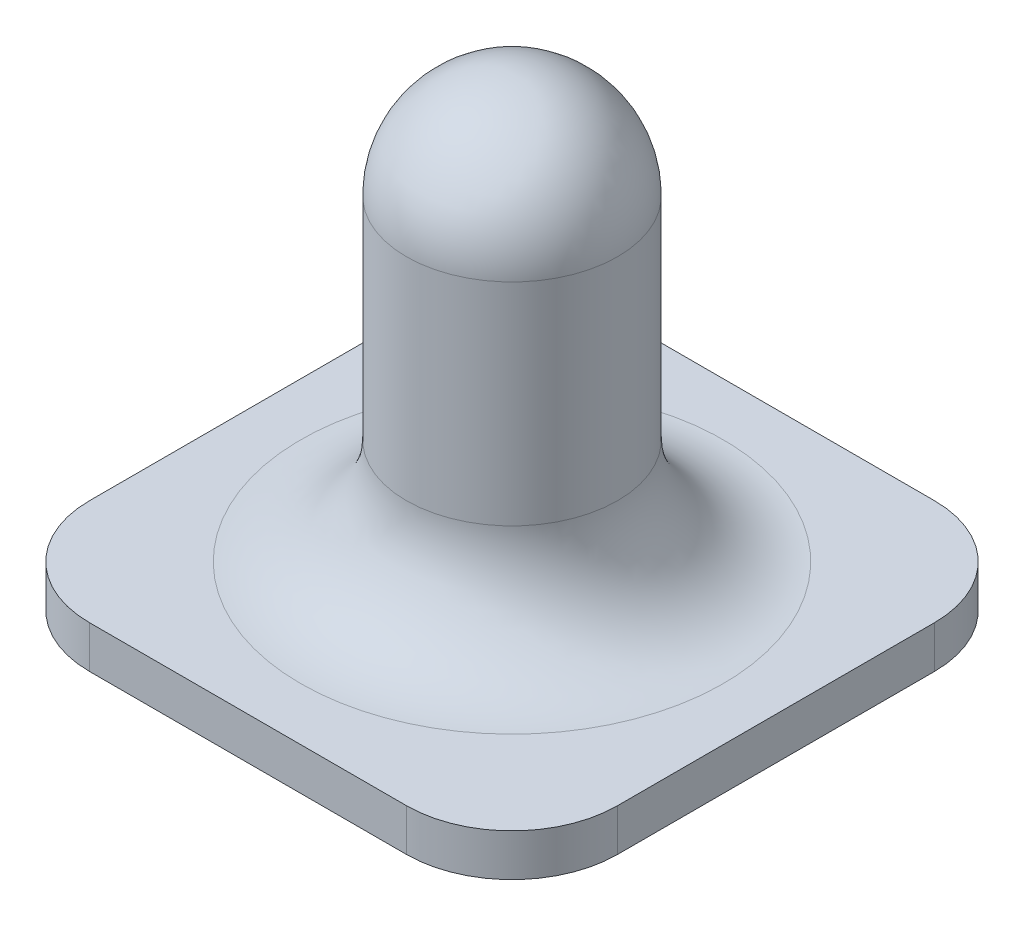
ISO-10303-21;
HEADER;
FILE_DESCRIPTION(('STEP AP214'),'2;1');
FILE_NAME('part.step','',(''),(''),'','','');
FILE_SCHEMA(('AUTOMOTIVE_DESIGN { 1 0 10303 214 1 1 1 1 }'));
ENDSEC;
DATA;
#1=APPLICATION_CONTEXT('core data for automotive mechanical design processes');
#2=APPLICATION_PROTOCOL_DEFINITION('international standard','automotive_design',2000,#1);
#3=PRODUCT_CONTEXT('',#1,'mechanical');
#4=PRODUCT('Part','Part','',(#3));
#5=PRODUCT_RELATED_PRODUCT_CATEGORY('part','',(#4));
#6=PRODUCT_DEFINITION_FORMATION('','',#4);
#7=PRODUCT_DEFINITION_CONTEXT('part definition',#1,'design');
#8=PRODUCT_DEFINITION('design','',#6,#7);
#9=PRODUCT_DEFINITION_SHAPE('','',#8);
#10=(LENGTH_UNIT() NAMED_UNIT(*) SI_UNIT(.MILLI.,.METRE.));
#11=(NAMED_UNIT(*) PLANE_ANGLE_UNIT() SI_UNIT($,.RADIAN.));
#12=(NAMED_UNIT(*) SI_UNIT($,.STERADIAN.) SOLID_ANGLE_UNIT());
#13=UNCERTAINTY_MEASURE_WITH_UNIT(LENGTH_MEASURE(1.E-05),#10,'distance_accuracy_value','');
#14=(GEOMETRIC_REPRESENTATION_CONTEXT(3) GLOBAL_UNCERTAINTY_ASSIGNED_CONTEXT((#13)) GLOBAL_UNIT_ASSIGNED_CONTEXT((#10,
#11,#12)) REPRESENTATION_CONTEXT('',''));
#15=CARTESIAN_POINT('',(0.,0.,0.));
#16=DIRECTION('',(0.,0.,1.));
#17=DIRECTION('',(1.,0.,0.));
#18=AXIS2_PLACEMENT_3D('',#15,#16,#17);
#19=CARTESIAN_POINT('',(0.,4.,0.));
#20=DIRECTION('',(1.,0.,0.));
#21=DIRECTION('',(0.,0.,-1.));
#22=AXIS2_PLACEMENT_3D('',#19,#20,#21);
#23=PLANE('',#22);
#24=DIRECTION('',(0.,0.,1.));
#25=VECTOR('',#24,1.);
#26=CARTESIAN_POINT('',(0.,0.,0.));
#27=LINE('',#26,#25);
#28=CARTESIAN_POINT('',(0.,0.,10.));
#29=VERTEX_POINT('',#28);
#30=CARTESIAN_POINT('',(0.,0.,40.));
#31=VERTEX_POINT('',#30);
#32=EDGE_CURVE('E168',#29,#31,#27,.T.);
#33=ORIENTED_EDGE('',*,*,#32,.T.);
#34=DIRECTION('',(0.,-1.,0.));
#35=VECTOR('',#34,1.);
#36=CARTESIAN_POINT('',(0.,4.,40.));
#37=LINE('',#36,#35);
#38=CARTESIAN_POINT('',(0.,4.,40.));
#39=VERTEX_POINT('',#38);
#40=EDGE_CURVE('E11',#31,#39,#37,.F.);
#41=ORIENTED_EDGE('',*,*,#40,.T.);
#42=DIRECTION('',(0.,0.,1.));
#43=VECTOR('',#42,1.);
#44=CARTESIAN_POINT('',(0.,4.,0.));
#45=LINE('',#44,#43);
#46=CARTESIAN_POINT('',(0.,4.,10.));
#47=VERTEX_POINT('',#46);
#48=EDGE_CURVE('E127',#47,#39,#45,.T.);
#49=ORIENTED_EDGE('',*,*,#48,.F.);
#50=DIRECTION('',(0.,-1.,0.));
#51=VECTOR('',#50,1.);
#52=CARTESIAN_POINT('',(0.,4.,10.));
#53=LINE('',#52,#51);
#54=EDGE_CURVE('E43',#47,#29,#53,.T.);
#55=ORIENTED_EDGE('',*,*,#54,.T.);
#56=EDGE_LOOP('',(#33,#41,#49,#55));
#57=FACE_BOUND('',#56,.T.);
#58=ADVANCED_FACE('F35',(#57),#23,.F.);
#59=CARTESIAN_POINT('',(0.,4.,50.));
#60=DIRECTION('',(0.,0.,-1.));
#61=DIRECTION('',(-1.,0.,0.));
#62=AXIS2_PLACEMENT_3D('',#59,#60,#61);
#63=PLANE('',#62);
#64=DIRECTION('',(1.,0.,0.));
#65=VECTOR('',#64,1.);
#66=CARTESIAN_POINT('',(0.,0.,50.));
#67=LINE('',#66,#65);
#68=CARTESIAN_POINT('',(10.,0.,50.));
#69=VERTEX_POINT('',#68);
#70=CARTESIAN_POINT('',(40.,0.,50.));
#71=VERTEX_POINT('',#70);
#72=EDGE_CURVE('E132',#69,#71,#67,.T.);
#73=ORIENTED_EDGE('',*,*,#72,.T.);
#74=DIRECTION('',(0.,-1.,0.));
#75=VECTOR('',#74,1.);
#76=CARTESIAN_POINT('',(40.,4.,50.));
#77=LINE('',#76,#75);
#78=CARTESIAN_POINT('',(40.,4.,50.));
#79=VERTEX_POINT('',#78);
#80=EDGE_CURVE('E50',#71,#79,#77,.F.);
#81=ORIENTED_EDGE('',*,*,#80,.T.);
#82=DIRECTION('',(1.,0.,0.));
#83=VECTOR('',#82,1.);
#84=CARTESIAN_POINT('',(0.,4.,50.));
#85=LINE('',#84,#83);
#86=CARTESIAN_POINT('',(10.,4.,50.));
#87=VERTEX_POINT('',#86);
#88=EDGE_CURVE('E130',#87,#79,#85,.T.);
#89=ORIENTED_EDGE('',*,*,#88,.F.);
#90=DIRECTION('',(0.,-1.,0.));
#91=VECTOR('',#90,1.);
#92=CARTESIAN_POINT('',(10.,4.,50.));
#93=LINE('',#92,#91);
#94=EDGE_CURVE('E160',#87,#69,#93,.T.);
#95=ORIENTED_EDGE('',*,*,#94,.T.);
#96=EDGE_LOOP('',(#73,#81,#89,#95));
#97=FACE_BOUND('',#96,.T.);
#98=ADVANCED_FACE('F188',(#97),#63,.F.);
#99=CARTESIAN_POINT('',(50.,4.,0.));
#100=DIRECTION('',(-1.,0.,0.));
#101=DIRECTION('',(0.,0.,1.));
#102=AXIS2_PLACEMENT_3D('',#99,#100,#101);
#103=PLANE('',#102);
#104=DIRECTION('',(0.,0.,-1.));
#105=VECTOR('',#104,1.);
#106=CARTESIAN_POINT('',(50.,0.,0.));
#107=LINE('',#106,#105);
#108=CARTESIAN_POINT('',(50.,0.,40.));
#109=VERTEX_POINT('',#108);
#110=CARTESIAN_POINT('',(50.,0.,10.));
#111=VERTEX_POINT('',#110);
#112=EDGE_CURVE('E128',#109,#111,#107,.T.);
#113=ORIENTED_EDGE('',*,*,#112,.T.);
#114=DIRECTION('',(0.,-1.,0.));
#115=VECTOR('',#114,1.);
#116=CARTESIAN_POINT('',(50.,4.,10.));
#117=LINE('',#116,#115);
#118=CARTESIAN_POINT('',(50.,4.,10.));
#119=VERTEX_POINT('',#118);
#120=EDGE_CURVE('E106',#111,#119,#117,.F.);
#121=ORIENTED_EDGE('',*,*,#120,.T.);
#122=DIRECTION('',(0.,0.,-1.));
#123=VECTOR('',#122,1.);
#124=CARTESIAN_POINT('',(50.,4.,0.));
#125=LINE('',#124,#123);
#126=CARTESIAN_POINT('',(50.,4.,40.));
#127=VERTEX_POINT('',#126);
#128=EDGE_CURVE('E176',#127,#119,#125,.T.);
#129=ORIENTED_EDGE('',*,*,#128,.F.);
#130=DIRECTION('',(0.,-1.,0.));
#131=VECTOR('',#130,1.);
#132=CARTESIAN_POINT('',(50.,4.,40.));
#133=LINE('',#132,#131);
#134=EDGE_CURVE('E111',#127,#109,#133,.T.);
#135=ORIENTED_EDGE('',*,*,#134,.T.);
#136=EDGE_LOOP('',(#113,#121,#129,#135));
#137=FACE_BOUND('',#136,.T.);
#138=ADVANCED_FACE('F187',(#137),#103,.F.);
#139=CARTESIAN_POINT('',(0.,4.,0.));
#140=DIRECTION('',(0.,0.,1.));
#141=DIRECTION('',(1.,0.,0.));
#142=AXIS2_PLACEMENT_3D('',#139,#140,#141);
#143=PLANE('',#142);
#144=DIRECTION('',(-1.,0.,0.));
#145=VECTOR('',#144,1.);
#146=CARTESIAN_POINT('',(0.,4.,0.));
#147=LINE('',#146,#145);
#148=CARTESIAN_POINT('',(40.,4.,0.));
#149=VERTEX_POINT('',#148);
#150=CARTESIAN_POINT('',(10.,4.,0.));
#151=VERTEX_POINT('',#150);
#152=EDGE_CURVE('E121',#149,#151,#147,.T.);
#153=ORIENTED_EDGE('',*,*,#152,.F.);
#154=DIRECTION('',(0.,-1.,0.));
#155=VECTOR('',#154,1.);
#156=CARTESIAN_POINT('',(40.,4.,0.));
#157=LINE('',#156,#155);
#158=CARTESIAN_POINT('',(40.,0.,0.));
#159=VERTEX_POINT('',#158);
#160=EDGE_CURVE('E105',#149,#159,#157,.T.);
#161=ORIENTED_EDGE('',*,*,#160,.T.);
#162=DIRECTION('',(-1.,0.,0.));
#163=VECTOR('',#162,1.);
#164=CARTESIAN_POINT('',(0.,0.,0.));
#165=LINE('',#164,#163);
#166=CARTESIAN_POINT('',(10.,0.,0.));
#167=VERTEX_POINT('',#166);
#168=EDGE_CURVE('E118',#159,#167,#165,.T.);
#169=ORIENTED_EDGE('',*,*,#168,.T.);
#170=DIRECTION('',(0.,-1.,0.));
#171=VECTOR('',#170,1.);
#172=CARTESIAN_POINT('',(10.,4.,0.));
#173=LINE('',#172,#171);
#174=EDGE_CURVE('E123',#167,#151,#173,.F.);
#175=ORIENTED_EDGE('',*,*,#174,.T.);
#176=EDGE_LOOP('',(#153,#161,#169,#175));
#177=FACE_BOUND('',#176,.T.);
#178=ADVANCED_FACE('F117',(#177),#143,.F.);
#179=CARTESIAN_POINT('',(0.,4.,0.));
#180=DIRECTION('',(0.,1.,0.));
#181=DIRECTION('',(0.,0.,1.));
#182=AXIS2_PLACEMENT_3D('',#179,#180,#181);
#183=PLANE('',#182);
#184=CARTESIAN_POINT('',(25.,4.,25.));
#185=DIRECTION('',(0.,1.,0.));
#186=DIRECTION('',(0.,0.,1.));
#187=AXIS2_PLACEMENT_3D('',#184,#185,#186);
#188=CIRCLE('',#187,20.);
#189=CARTESIAN_POINT('',(25.,4.,45.));
#190=VERTEX_POINT('',#189);
#191=EDGE_CURVE('E139',#190,#190,#188,.F.);
#192=ORIENTED_EDGE('',*,*,#191,.T.);
#193=EDGE_LOOP('',(#192));
#194=FACE_BOUND('',#193,.T.);
#195=ORIENTED_EDGE('',*,*,#128,.T.);
#196=CARTESIAN_POINT('',(40.,4.,10.));
#197=DIRECTION('',(0.,1.,0.));
#198=DIRECTION('',(0.,0.,1.));
#199=AXIS2_PLACEMENT_3D('',#196,#197,#198);
#200=CIRCLE('',#199,10.);
#201=EDGE_CURVE('E158',#119,#149,#200,.T.);
#202=ORIENTED_EDGE('',*,*,#201,.T.);
#203=ORIENTED_EDGE('',*,*,#152,.T.);
#204=CARTESIAN_POINT('',(10.,4.,10.));
#205=DIRECTION('',(0.,1.,0.));
#206=DIRECTION('',(0.,0.,1.));
#207=AXIS2_PLACEMENT_3D('',#204,#205,#206);
#208=CIRCLE('',#207,10.);
#209=EDGE_CURVE('E153',#151,#47,#208,.T.);
#210=ORIENTED_EDGE('',*,*,#209,.T.);
#211=ORIENTED_EDGE('',*,*,#48,.T.);
#212=CARTESIAN_POINT('',(10.,4.,40.));
#213=DIRECTION('',(0.,1.,0.));
#214=DIRECTION('',(0.,0.,1.));
#215=AXIS2_PLACEMENT_3D('',#212,#213,#214);
#216=CIRCLE('',#215,10.);
#217=EDGE_CURVE('E57',#39,#87,#216,.T.);
#218=ORIENTED_EDGE('',*,*,#217,.T.);
#219=ORIENTED_EDGE('',*,*,#88,.T.);
#220=CARTESIAN_POINT('',(40.,4.,40.));
#221=DIRECTION('',(0.,1.,0.));
#222=DIRECTION('',(0.,0.,1.));
#223=AXIS2_PLACEMENT_3D('',#220,#221,#222);
#224=CIRCLE('',#223,10.);
#225=EDGE_CURVE('E156',#79,#127,#224,.T.);
#226=ORIENTED_EDGE('',*,*,#225,.T.);
#227=EDGE_LOOP('',(#195,#202,#203,#210,#211,#218,#219,#226));
#228=FACE_BOUND('',#227,.T.);
#229=ADVANCED_FACE('F180',(#194,#228),#183,.T.);
#230=CARTESIAN_POINT('',(0.,0.,0.));
#231=DIRECTION('',(0.,1.,0.));
#232=DIRECTION('',(0.,0.,1.));
#233=AXIS2_PLACEMENT_3D('',#230,#231,#232);
#234=PLANE('',#233);
#235=ORIENTED_EDGE('',*,*,#168,.F.);
#236=CARTESIAN_POINT('',(40.,0.,10.));
#237=DIRECTION('',(0.,1.,0.));
#238=DIRECTION('',(0.,0.,1.));
#239=AXIS2_PLACEMENT_3D('',#236,#237,#238);
#240=CIRCLE('',#239,10.);
#241=EDGE_CURVE('E101',#159,#111,#240,.F.);
#242=ORIENTED_EDGE('',*,*,#241,.T.);
#243=ORIENTED_EDGE('',*,*,#112,.F.);
#244=CARTESIAN_POINT('',(40.,0.,40.));
#245=DIRECTION('',(0.,1.,0.));
#246=DIRECTION('',(0.,0.,1.));
#247=AXIS2_PLACEMENT_3D('',#244,#245,#246);
#248=CIRCLE('',#247,10.);
#249=EDGE_CURVE('E112',#109,#71,#248,.F.);
#250=ORIENTED_EDGE('',*,*,#249,.T.);
#251=ORIENTED_EDGE('',*,*,#72,.F.);
#252=CARTESIAN_POINT('',(10.,0.,40.));
#253=DIRECTION('',(0.,1.,0.));
#254=DIRECTION('',(0.,0.,1.));
#255=AXIS2_PLACEMENT_3D('',#252,#253,#254);
#256=CIRCLE('',#255,10.);
#257=EDGE_CURVE('E147',#69,#31,#256,.F.);
#258=ORIENTED_EDGE('',*,*,#257,.T.);
#259=ORIENTED_EDGE('',*,*,#32,.F.);
#260=CARTESIAN_POINT('',(10.,0.,10.));
#261=DIRECTION('',(0.,1.,0.));
#262=DIRECTION('',(0.,0.,1.));
#263=AXIS2_PLACEMENT_3D('',#260,#261,#262);
#264=CIRCLE('',#263,10.);
#265=EDGE_CURVE('E122',#29,#167,#264,.F.);
#266=ORIENTED_EDGE('',*,*,#265,.T.);
#267=EDGE_LOOP('',(#235,#242,#243,#250,#251,#258,#259,#266));
#268=FACE_BOUND('',#267,.T.);
#269=ADVANCED_FACE('F125',(#268),#234,.F.);
#270=CARTESIAN_POINT('',(25.,44.,25.));
#271=DIRECTION('',(0.,-1.,0.));
#272=DIRECTION('',(0.,0.,-1.));
#273=AXIS2_PLACEMENT_3D('',#270,#271,#272);
#274=CYLINDRICAL_SURFACE('',#273,10.);
#275=CARTESIAN_POINT('',(25.,34.,25.));
#276=DIRECTION('',(0.,-1.,0.));
#277=DIRECTION('',(0.,0.,-1.));
#278=AXIS2_PLACEMENT_3D('',#275,#276,#277);
#279=CIRCLE('',#278,10.);
#280=CARTESIAN_POINT('',(25.,34.,15.));
#281=VERTEX_POINT('',#280);
#282=EDGE_CURVE('E142',#281,#281,#279,.T.);
#283=ORIENTED_EDGE('',*,*,#282,.T.);
#284=EDGE_LOOP('',(#283));
#285=FACE_BOUND('',#284,.T.);
#286=CARTESIAN_POINT('',(25.,14.,25.));
#287=DIRECTION('',(0.,1.,0.));
#288=DIRECTION('',(0.,0.,1.));
#289=AXIS2_PLACEMENT_3D('',#286,#287,#288);
#290=CIRCLE('',#289,10.);
#291=CARTESIAN_POINT('',(25.,14.,35.));
#292=VERTEX_POINT('',#291);
#293=EDGE_CURVE('E136',#292,#292,#290,.T.);
#294=ORIENTED_EDGE('',*,*,#293,.T.);
#295=EDGE_LOOP('',(#294));
#296=FACE_BOUND('',#295,.T.);
#297=ADVANCED_FACE('F207',(#285,#296),#274,.T.);
#298=CARTESIAN_POINT('',(25.,14.,25.));
#299=DIRECTION('',(0.,1.,0.));
#300=DIRECTION('',(0.,0.,1.));
#301=AXIS2_PLACEMENT_3D('',#298,#299,#300);
#302=TOROIDAL_SURFACE('',#301,20.,10.);
#303=ORIENTED_EDGE('',*,*,#191,.F.);
#304=EDGE_LOOP('',(#303));
#305=FACE_BOUND('',#304,.T.);
#306=ORIENTED_EDGE('',*,*,#293,.F.);
#307=EDGE_LOOP('',(#306));
#308=FACE_BOUND('',#307,.T.);
#309=ADVANCED_FACE('F203',(#305,#308),#302,.F.);
#310=CARTESIAN_POINT('',(25.,34.,25.));
#311=DIRECTION('',(0.,1.,0.));
#312=DIRECTION('',(0.,0.,1.));
#313=AXIS2_PLACEMENT_3D('',#310,#311,#312);
#314=SPHERICAL_SURFACE('',#313,10.);
#315=ORIENTED_EDGE('',*,*,#282,.F.);
#316=EDGE_LOOP('',(#315));
#317=FACE_BOUND('',#316,.T.);
#318=ADVANCED_FACE('F206',(#317),#314,.T.);
#319=CARTESIAN_POINT('',(40.,4.,10.));
#320=DIRECTION('',(0.,-1.,0.));
#321=DIRECTION('',(0.,0.,-1.));
#322=AXIS2_PLACEMENT_3D('',#319,#320,#321);
#323=CYLINDRICAL_SURFACE('',#322,10.);
#324=ORIENTED_EDGE('',*,*,#201,.F.);
#325=ORIENTED_EDGE('',*,*,#120,.F.);
#326=ORIENTED_EDGE('',*,*,#241,.F.);
#327=ORIENTED_EDGE('',*,*,#160,.F.);
#328=EDGE_LOOP('',(#324,#325,#326,#327));
#329=FACE_BOUND('',#328,.T.);
#330=ADVANCED_FACE('F104',(#329),#323,.T.);
#331=CARTESIAN_POINT('',(40.,4.,40.));
#332=DIRECTION('',(0.,-1.,0.));
#333=DIRECTION('',(0.,0.,-1.));
#334=AXIS2_PLACEMENT_3D('',#331,#332,#333);
#335=CYLINDRICAL_SURFACE('',#334,10.);
#336=ORIENTED_EDGE('',*,*,#225,.F.);
#337=ORIENTED_EDGE('',*,*,#80,.F.);
#338=ORIENTED_EDGE('',*,*,#249,.F.);
#339=ORIENTED_EDGE('',*,*,#134,.F.);
#340=EDGE_LOOP('',(#336,#337,#338,#339));
#341=FACE_BOUND('',#340,.T.);
#342=ADVANCED_FACE('F185',(#341),#335,.T.);
#343=CARTESIAN_POINT('',(10.,4.,40.));
#344=DIRECTION('',(0.,-1.,0.));
#345=DIRECTION('',(0.,0.,-1.));
#346=AXIS2_PLACEMENT_3D('',#343,#344,#345);
#347=CYLINDRICAL_SURFACE('',#346,10.);
#348=ORIENTED_EDGE('',*,*,#217,.F.);
#349=ORIENTED_EDGE('',*,*,#40,.F.);
#350=ORIENTED_EDGE('',*,*,#257,.F.);
#351=ORIENTED_EDGE('',*,*,#94,.F.);
#352=EDGE_LOOP('',(#348,#349,#350,#351));
#353=FACE_BOUND('',#352,.T.);
#354=ADVANCED_FACE('F190',(#353),#347,.T.);
#355=CARTESIAN_POINT('',(10.,4.,10.));
#356=DIRECTION('',(0.,-1.,0.));
#357=DIRECTION('',(0.,0.,-1.));
#358=AXIS2_PLACEMENT_3D('',#355,#356,#357);
#359=CYLINDRICAL_SURFACE('',#358,10.);
#360=ORIENTED_EDGE('',*,*,#209,.F.);
#361=ORIENTED_EDGE('',*,*,#174,.F.);
#362=ORIENTED_EDGE('',*,*,#265,.F.);
#363=ORIENTED_EDGE('',*,*,#54,.F.);
#364=EDGE_LOOP('',(#360,#361,#362,#363));
#365=FACE_BOUND('',#364,.T.);
#366=ADVANCED_FACE('F37',(#365),#359,.T.);
#367=CLOSED_SHELL('',(#58,#98,#138,#178,#229,#269,#297,#309,#318,#330,#342,#354,#366));
#368=MANIFOLD_SOLID_BREP('B2',#367);
#369=ADVANCED_BREP_SHAPE_REPRESENTATION('',(#18,#368),#14);
#370=SHAPE_DEFINITION_REPRESENTATION(#9,#369);
ENDSEC;
END-ISO-10303-21;
